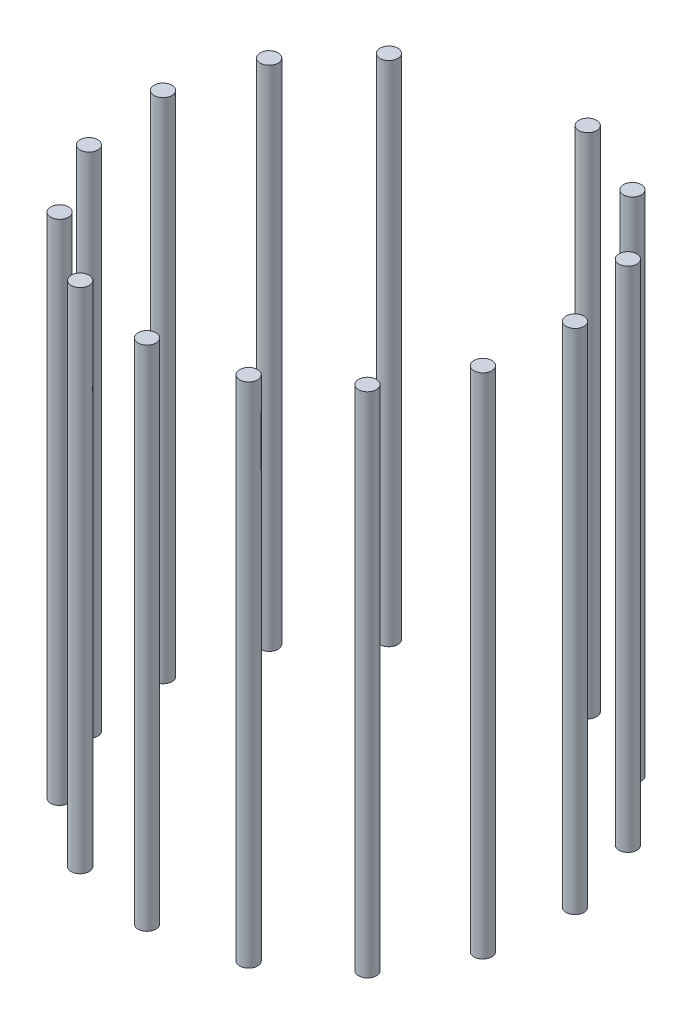
ISO-10303-21;
HEADER;
FILE_DESCRIPTION(('STEP AP214'),'2;1');
FILE_NAME('part.step','',(''),(''),'','','');
FILE_SCHEMA(('AUTOMOTIVE_DESIGN { 1 0 10303 214 1 1 1 1 }'));
ENDSEC;
DATA;
#1=APPLICATION_CONTEXT('core data for automotive mechanical design processes');
#2=APPLICATION_PROTOCOL_DEFINITION('international standard','automotive_design',2000,#1);
#3=PRODUCT_CONTEXT('',#1,'mechanical');
#4=PRODUCT('Part','Part','',(#3));
#5=PRODUCT_RELATED_PRODUCT_CATEGORY('part','',(#4));
#6=PRODUCT_DEFINITION_FORMATION('','',#4);
#7=PRODUCT_DEFINITION_CONTEXT('part definition',#1,'design');
#8=PRODUCT_DEFINITION('design','',#6,#7);
#9=PRODUCT_DEFINITION_SHAPE('','',#8);
#10=(LENGTH_UNIT() NAMED_UNIT(*) SI_UNIT(.MILLI.,.METRE.));
#11=(NAMED_UNIT(*) PLANE_ANGLE_UNIT() SI_UNIT($,.RADIAN.));
#12=(NAMED_UNIT(*) SI_UNIT($,.STERADIAN.) SOLID_ANGLE_UNIT());
#13=UNCERTAINTY_MEASURE_WITH_UNIT(LENGTH_MEASURE(1.E-05),#10,'distance_accuracy_value','');
#14=(GEOMETRIC_REPRESENTATION_CONTEXT(3) GLOBAL_UNCERTAINTY_ASSIGNED_CONTEXT((#13)) GLOBAL_UNIT_ASSIGNED_CONTEXT((#10,
#11,#12)) REPRESENTATION_CONTEXT('',''));
#15=CARTESIAN_POINT('',(0.,0.,0.));
#16=DIRECTION('',(0.,0.,1.));
#17=DIRECTION('',(1.,0.,0.));
#18=AXIS2_PLACEMENT_3D('',#15,#16,#17);
#19=CARTESIAN_POINT('',(9.40954454457373,19.9,-4.78134999789198));
#20=DIRECTION('',(0.,-1.,0.));
#21=DIRECTION('',(0.,0.,-1.));
#22=AXIS2_PLACEMENT_3D('',#19,#20,#21);
#23=CYLINDRICAL_SURFACE('',#22,0.350000000000002);
#24=CARTESIAN_POINT('',(9.40954454457373,19.9,-4.78134999789198));
#25=DIRECTION('',(0.,1.,0.));
#26=DIRECTION('',(0.,0.,1.));
#27=AXIS2_PLACEMENT_3D('',#24,#25,#26);
#28=CIRCLE('',#27,0.350000000000002);
#29=CARTESIAN_POINT('',(9.40954454457373,19.9,-4.43134999789198));
#30=VERTEX_POINT('',#29);
#31=EDGE_CURVE('E11',#30,#30,#28,.T.);
#32=ORIENTED_EDGE('',*,*,#31,.F.);
#33=EDGE_LOOP('',(#32));
#34=FACE_BOUND('',#33,.T.);
#35=CARTESIAN_POINT('',(9.40954454457373,0.,-4.78134999789198));
#36=DIRECTION('',(0.,1.,0.));
#37=DIRECTION('',(0.,0.,1.));
#38=AXIS2_PLACEMENT_3D('',#35,#36,#37);
#39=CIRCLE('',#38,0.350000000000002);
#40=CARTESIAN_POINT('',(9.40954454457373,0.,-4.43134999789198));
#41=VERTEX_POINT('',#40);
#42=EDGE_CURVE('E45',#41,#41,#39,.T.);
#43=ORIENTED_EDGE('',*,*,#42,.T.);
#44=EDGE_LOOP('',(#43));
#45=FACE_BOUND('',#44,.T.);
#46=ADVANCED_FACE('F42',(#34,#45),#23,.T.);
#47=CARTESIAN_POINT('',(9.40954454457373,19.9,-4.78134999789198));
#48=DIRECTION('',(0.,1.,0.));
#49=DIRECTION('',(0.,0.,1.));
#50=AXIS2_PLACEMENT_3D('',#47,#48,#49);
#51=PLANE('',#50);
#52=ORIENTED_EDGE('',*,*,#31,.T.);
#53=EDGE_LOOP('',(#52));
#54=FACE_BOUND('',#53,.T.);
#55=ADVANCED_FACE('F57',(#54),#51,.T.);
#56=CARTESIAN_POINT('',(9.40954454457373,0.,-4.78134999789198));
#57=DIRECTION('',(0.,1.,0.));
#58=DIRECTION('',(0.,0.,1.));
#59=AXIS2_PLACEMENT_3D('',#56,#57,#58);
#60=PLANE('',#59);
#61=ORIENTED_EDGE('',*,*,#42,.F.);
#62=EDGE_LOOP('',(#61));
#63=FACE_BOUND('',#62,.T.);
#64=ADVANCED_FACE('F55',(#63),#60,.F.);
#65=CLOSED_SHELL('',(#46,#55,#64));
#66=MANIFOLD_SOLID_BREP('B2',#65);
#67=CARTESIAN_POINT('',(7.22085409713997,19.9,-2.2761922090373));
#68=DIRECTION('',(0.,-1.,0.));
#69=DIRECTION('',(0.,0.,-1.));
#70=AXIS2_PLACEMENT_3D('',#67,#68,#69);
#71=CYLINDRICAL_SURFACE('',#70,0.35);
#72=CARTESIAN_POINT('',(7.22085409713997,19.9,-2.2761922090373));
#73=DIRECTION('',(0.,1.,0.));
#74=DIRECTION('',(0.,0.,1.));
#75=AXIS2_PLACEMENT_3D('',#72,#73,#74);
#76=CIRCLE('',#75,0.35);
#77=CARTESIAN_POINT('',(7.22085409713997,19.9,-1.9261922090373));
#78=VERTEX_POINT('',#77);
#79=EDGE_CURVE('E41',#78,#78,#76,.T.);
#80=ORIENTED_EDGE('',*,*,#79,.F.);
#81=EDGE_LOOP('',(#80));
#82=FACE_BOUND('',#81,.T.);
#83=CARTESIAN_POINT('',(7.22085409713997,0.,-2.2761922090373));
#84=DIRECTION('',(0.,1.,0.));
#85=DIRECTION('',(0.,0.,1.));
#86=AXIS2_PLACEMENT_3D('',#83,#84,#85);
#87=CIRCLE('',#86,0.35);
#88=CARTESIAN_POINT('',(7.22085409713997,0.,-1.9261922090373));
#89=VERTEX_POINT('',#88);
#90=EDGE_CURVE('E94',#89,#89,#87,.T.);
#91=ORIENTED_EDGE('',*,*,#90,.T.);
#92=EDGE_LOOP('',(#91));
#93=FACE_BOUND('',#92,.T.);
#94=ADVANCED_FACE('F91',(#82,#93),#71,.T.);
#95=CARTESIAN_POINT('',(7.22085409713997,19.9,-2.2761922090373));
#96=DIRECTION('',(0.,1.,0.));
#97=DIRECTION('',(0.,0.,1.));
#98=AXIS2_PLACEMENT_3D('',#95,#96,#97);
#99=PLANE('',#98);
#100=ORIENTED_EDGE('',*,*,#79,.T.);
#101=EDGE_LOOP('',(#100));
#102=FACE_BOUND('',#101,.T.);
#103=ADVANCED_FACE('F106',(#102),#99,.T.);
#104=CARTESIAN_POINT('',(7.22085409713997,0.,-2.2761922090373));
#105=DIRECTION('',(0.,1.,0.));
#106=DIRECTION('',(0.,0.,1.));
#107=AXIS2_PLACEMENT_3D('',#104,#105,#106);
#108=PLANE('',#107);
#109=ORIENTED_EDGE('',*,*,#90,.F.);
#110=EDGE_LOOP('',(#109));
#111=FACE_BOUND('',#110,.T.);
#112=ADVANCED_FACE('F104',(#111),#108,.F.);
#113=CLOSED_SHELL('',(#94,#103,#112));
#114=MANIFOLD_SOLID_BREP('B6',#113);
#115=CARTESIAN_POINT('',(6.24032535011504,19.9,0.902603914970171));
#116=DIRECTION('',(0.,-1.,0.));
#117=DIRECTION('',(0.,0.,-1.));
#118=AXIS2_PLACEMENT_3D('',#115,#116,#117);
#119=CYLINDRICAL_SURFACE('',#118,0.35);
#120=CARTESIAN_POINT('',(6.24032535011504,19.9,0.902603914970171));
#121=DIRECTION('',(0.,1.,0.));
#122=DIRECTION('',(0.,0.,1.));
#123=AXIS2_PLACEMENT_3D('',#120,#121,#122);
#124=CIRCLE('',#123,0.35);
#125=CARTESIAN_POINT('',(6.24032535011504,19.9,1.25260391497017));
#126=VERTEX_POINT('',#125);
#127=EDGE_CURVE('E90',#126,#126,#124,.T.);
#128=ORIENTED_EDGE('',*,*,#127,.F.);
#129=EDGE_LOOP('',(#128));
#130=FACE_BOUND('',#129,.T.);
#131=CARTESIAN_POINT('',(6.24032535011504,0.,0.902603914970171));
#132=DIRECTION('',(0.,1.,0.));
#133=DIRECTION('',(0.,0.,1.));
#134=AXIS2_PLACEMENT_3D('',#131,#132,#133);
#135=CIRCLE('',#134,0.35);
#136=CARTESIAN_POINT('',(6.24032535011504,0.,1.25260391497017));
#137=VERTEX_POINT('',#136);
#138=EDGE_CURVE('E143',#137,#137,#135,.T.);
#139=ORIENTED_EDGE('',*,*,#138,.T.);
#140=EDGE_LOOP('',(#139));
#141=FACE_BOUND('',#140,.T.);
#142=ADVANCED_FACE('F140',(#130,#141),#119,.T.);
#143=CARTESIAN_POINT('',(6.24032535011504,19.9,0.902603914970171));
#144=DIRECTION('',(0.,1.,0.));
#145=DIRECTION('',(0.,0.,1.));
#146=AXIS2_PLACEMENT_3D('',#143,#144,#145);
#147=PLANE('',#146);
#148=ORIENTED_EDGE('',*,*,#127,.T.);
#149=EDGE_LOOP('',(#148));
#150=FACE_BOUND('',#149,.T.);
#151=ADVANCED_FACE('F155',(#150),#147,.T.);
#152=CARTESIAN_POINT('',(6.24032535011504,0.,0.902603914970171));
#153=DIRECTION('',(0.,1.,0.));
#154=DIRECTION('',(0.,0.,1.));
#155=AXIS2_PLACEMENT_3D('',#152,#153,#154);
#156=PLANE('',#155);
#157=ORIENTED_EDGE('',*,*,#138,.F.);
#158=EDGE_LOOP('',(#157));
#159=FACE_BOUND('',#158,.T.);
#160=ADVANCED_FACE('F153',(#159),#156,.F.);
#161=CLOSED_SHELL('',(#142,#151,#160));
#162=MANIFOLD_SOLID_BREP('B36',#161);
#163=CARTESIAN_POINT('',(6.6375006316836,19.9,4.20539564583333));
#164=DIRECTION('',(0.,-1.,0.));
#165=DIRECTION('',(0.,0.,-1.));
#166=AXIS2_PLACEMENT_3D('',#163,#164,#165);
#167=CYLINDRICAL_SURFACE('',#166,0.35);
#168=CARTESIAN_POINT('',(6.6375006316836,19.9,4.20539564583333));
#169=DIRECTION('',(0.,1.,0.));
#170=DIRECTION('',(0.,0.,1.));
#171=AXIS2_PLACEMENT_3D('',#168,#169,#170);
#172=CIRCLE('',#171,0.35);
#173=CARTESIAN_POINT('',(6.6375006316836,19.9,4.55539564583333));
#174=VERTEX_POINT('',#173);
#175=EDGE_CURVE('E139',#174,#174,#172,.T.);
#176=ORIENTED_EDGE('',*,*,#175,.F.);
#177=EDGE_LOOP('',(#176));
#178=FACE_BOUND('',#177,.T.);
#179=CARTESIAN_POINT('',(6.6375006316836,0.,4.20539564583333));
#180=DIRECTION('',(0.,1.,0.));
#181=DIRECTION('',(0.,0.,1.));
#182=AXIS2_PLACEMENT_3D('',#179,#180,#181);
#183=CIRCLE('',#182,0.35);
#184=CARTESIAN_POINT('',(6.6375006316836,0.,4.55539564583333));
#185=VERTEX_POINT('',#184);
#186=EDGE_CURVE('E192',#185,#185,#183,.T.);
#187=ORIENTED_EDGE('',*,*,#186,.T.);
#188=EDGE_LOOP('',(#187));
#189=FACE_BOUND('',#188,.T.);
#190=ADVANCED_FACE('F189',(#178,#189),#167,.T.);
#191=CARTESIAN_POINT('',(6.6375006316836,19.9,4.20539564583333));
#192=DIRECTION('',(0.,1.,0.));
#193=DIRECTION('',(0.,0.,1.));
#194=AXIS2_PLACEMENT_3D('',#191,#192,#193);
#195=PLANE('',#194);
#196=ORIENTED_EDGE('',*,*,#175,.T.);
#197=EDGE_LOOP('',(#196));
#198=FACE_BOUND('',#197,.T.);
#199=ADVANCED_FACE('F204',(#198),#195,.T.);
#200=CARTESIAN_POINT('',(6.6375006316836,0.,4.20539564583333));
#201=DIRECTION('',(0.,1.,0.));
#202=DIRECTION('',(0.,0.,1.));
#203=AXIS2_PLACEMENT_3D('',#200,#201,#202);
#204=PLANE('',#203);
#205=ORIENTED_EDGE('',*,*,#186,.F.);
#206=EDGE_LOOP('',(#205));
#207=FACE_BOUND('',#206,.T.);
#208=ADVANCED_FACE('F202',(#207),#204,.F.);
#209=CLOSED_SHELL('',(#190,#199,#208));
#210=MANIFOLD_SOLID_BREP('B85',#209);
#211=CARTESIAN_POINT('',(8.34370472743826,19.9,7.06110028836503));
#212=DIRECTION('',(0.,-1.,0.));
#213=DIRECTION('',(0.,0.,-1.));
#214=AXIS2_PLACEMENT_3D('',#211,#212,#213);
#215=CYLINDRICAL_SURFACE('',#214,0.35);
#216=CARTESIAN_POINT('',(8.34370472743826,19.9,7.06110028836503));
#217=DIRECTION('',(0.,1.,0.));
#218=DIRECTION('',(0.,0.,1.));
#219=AXIS2_PLACEMENT_3D('',#216,#217,#218);
#220=CIRCLE('',#219,0.35);
#221=CARTESIAN_POINT('',(8.34370472743826,19.9,7.41110028836503));
#222=VERTEX_POINT('',#221);
#223=EDGE_CURVE('E188',#222,#222,#220,.T.);
#224=ORIENTED_EDGE('',*,*,#223,.F.);
#225=EDGE_LOOP('',(#224));
#226=FACE_BOUND('',#225,.T.);
#227=CARTESIAN_POINT('',(8.34370472743826,0.,7.06110028836503));
#228=DIRECTION('',(0.,1.,0.));
#229=DIRECTION('',(0.,0.,1.));
#230=AXIS2_PLACEMENT_3D('',#227,#228,#229);
#231=CIRCLE('',#230,0.35);
#232=CARTESIAN_POINT('',(8.34370472743826,0.,7.41110028836503));
#233=VERTEX_POINT('',#232);
#234=EDGE_CURVE('E241',#233,#233,#231,.T.);
#235=ORIENTED_EDGE('',*,*,#234,.T.);
#236=EDGE_LOOP('',(#235));
#237=FACE_BOUND('',#236,.T.);
#238=ADVANCED_FACE('F238',(#226,#237),#215,.T.);
#239=CARTESIAN_POINT('',(8.34370472743826,19.9,7.06110028836503));
#240=DIRECTION('',(0.,1.,0.));
#241=DIRECTION('',(0.,0.,1.));
#242=AXIS2_PLACEMENT_3D('',#239,#240,#241);
#243=PLANE('',#242);
#244=ORIENTED_EDGE('',*,*,#223,.T.);
#245=EDGE_LOOP('',(#244));
#246=FACE_BOUND('',#245,.T.);
#247=ADVANCED_FACE('F253',(#246),#243,.T.);
#248=CARTESIAN_POINT('',(8.34370472743826,0.,7.06110028836503));
#249=DIRECTION('',(0.,1.,0.));
#250=DIRECTION('',(0.,0.,1.));
#251=AXIS2_PLACEMENT_3D('',#248,#249,#250);
#252=PLANE('',#251);
#253=ORIENTED_EDGE('',*,*,#234,.F.);
#254=EDGE_LOOP('',(#253));
#255=FACE_BOUND('',#254,.T.);
#256=ADVANCED_FACE('F251',(#255),#252,.F.);
#257=CLOSED_SHELL('',(#238,#247,#256));
#258=MANIFOLD_SOLID_BREP('B134',#257);
#259=CARTESIAN_POINT('',(11.0639194488455,19.9,8.97594056660932));
#260=DIRECTION('',(0.,-1.,0.));
#261=DIRECTION('',(0.,0.,-1.));
#262=AXIS2_PLACEMENT_3D('',#259,#260,#261);
#263=CYLINDRICAL_SURFACE('',#262,0.35);
#264=CARTESIAN_POINT('',(11.0639194488455,19.9,8.97594056660932));
#265=DIRECTION('',(0.,1.,0.));
#266=DIRECTION('',(0.,0.,1.));
#267=AXIS2_PLACEMENT_3D('',#264,#265,#266);
#268=CIRCLE('',#267,0.35);
#269=CARTESIAN_POINT('',(11.0639194488455,19.9,9.32594056660932));
#270=VERTEX_POINT('',#269);
#271=EDGE_CURVE('E237',#270,#270,#268,.T.);
#272=ORIENTED_EDGE('',*,*,#271,.F.);
#273=EDGE_LOOP('',(#272));
#274=FACE_BOUND('',#273,.T.);
#275=CARTESIAN_POINT('',(11.0639194488455,0.,8.97594056660932));
#276=DIRECTION('',(0.,1.,0.));
#277=DIRECTION('',(0.,0.,1.));
#278=AXIS2_PLACEMENT_3D('',#275,#276,#277);
#279=CIRCLE('',#278,0.35);
#280=CARTESIAN_POINT('',(11.0639194488455,0.,9.32594056660932));
#281=VERTEX_POINT('',#280);
#282=EDGE_CURVE('E290',#281,#281,#279,.T.);
#283=ORIENTED_EDGE('',*,*,#282,.T.);
#284=EDGE_LOOP('',(#283));
#285=FACE_BOUND('',#284,.T.);
#286=ADVANCED_FACE('F287',(#274,#285),#263,.T.);
#287=CARTESIAN_POINT('',(11.0639194488455,19.9,8.97594056660932));
#288=DIRECTION('',(0.,1.,0.));
#289=DIRECTION('',(0.,0.,1.));
#290=AXIS2_PLACEMENT_3D('',#287,#288,#289);
#291=PLANE('',#290);
#292=ORIENTED_EDGE('',*,*,#271,.T.);
#293=EDGE_LOOP('',(#292));
#294=FACE_BOUND('',#293,.T.);
#295=ADVANCED_FACE('F302',(#294),#291,.T.);
#296=CARTESIAN_POINT('',(11.0639194488455,0.,8.97594056660932));
#297=DIRECTION('',(0.,1.,0.));
#298=DIRECTION('',(0.,0.,1.));
#299=AXIS2_PLACEMENT_3D('',#296,#297,#298);
#300=PLANE('',#299);
#301=ORIENTED_EDGE('',*,*,#282,.F.);
#302=EDGE_LOOP('',(#301));
#303=FACE_BOUND('',#302,.T.);
#304=ADVANCED_FACE('F300',(#303),#300,.F.);
#305=CLOSED_SHELL('',(#286,#295,#304));
#306=MANIFOLD_SOLID_BREP('B183',#305);
#307=CARTESIAN_POINT('',(14.327794958199,19.9,9.61882320067994));
#308=DIRECTION('',(0.,-1.,0.));
#309=DIRECTION('',(0.,0.,-1.));
#310=AXIS2_PLACEMENT_3D('',#307,#308,#309);
#311=CYLINDRICAL_SURFACE('',#310,0.349999999999999);
#312=CARTESIAN_POINT('',(14.327794958199,19.9,9.61882320067994));
#313=DIRECTION('',(0.,1.,0.));
#314=DIRECTION('',(0.,0.,1.));
#315=AXIS2_PLACEMENT_3D('',#312,#313,#314);
#316=CIRCLE('',#315,0.349999999999999);
#317=CARTESIAN_POINT('',(14.327794958199,19.9,9.96882320067994));
#318=VERTEX_POINT('',#317);
#319=EDGE_CURVE('E286',#318,#318,#316,.T.);
#320=ORIENTED_EDGE('',*,*,#319,.F.);
#321=EDGE_LOOP('',(#320));
#322=FACE_BOUND('',#321,.T.);
#323=CARTESIAN_POINT('',(14.327794958199,0.,9.61882320067994));
#324=DIRECTION('',(0.,1.,0.));
#325=DIRECTION('',(0.,0.,1.));
#326=AXIS2_PLACEMENT_3D('',#323,#324,#325);
#327=CIRCLE('',#326,0.349999999999999);
#328=CARTESIAN_POINT('',(14.327794958199,0.,9.96882320067994));
#329=VERTEX_POINT('',#328);
#330=EDGE_CURVE('E339',#329,#329,#327,.T.);
#331=ORIENTED_EDGE('',*,*,#330,.T.);
#332=EDGE_LOOP('',(#331));
#333=FACE_BOUND('',#332,.T.);
#334=ADVANCED_FACE('F336',(#322,#333),#311,.T.);
#335=CARTESIAN_POINT('',(14.327794958199,19.9,9.61882320067994));
#336=DIRECTION('',(0.,1.,0.));
#337=DIRECTION('',(0.,0.,1.));
#338=AXIS2_PLACEMENT_3D('',#335,#336,#337);
#339=PLANE('',#338);
#340=ORIENTED_EDGE('',*,*,#319,.T.);
#341=EDGE_LOOP('',(#340));
#342=FACE_BOUND('',#341,.T.);
#343=ADVANCED_FACE('F351',(#342),#339,.T.);
#344=CARTESIAN_POINT('',(14.327794958199,0.,9.61882320067994));
#345=DIRECTION('',(0.,1.,0.));
#346=DIRECTION('',(0.,0.,1.));
#347=AXIS2_PLACEMENT_3D('',#344,#345,#346);
#348=PLANE('',#347);
#349=ORIENTED_EDGE('',*,*,#330,.F.);
#350=EDGE_LOOP('',(#349));
#351=FACE_BOUND('',#350,.T.);
#352=ADVANCED_FACE('F349',(#351),#348,.F.);
#353=CLOSED_SHELL('',(#334,#343,#352));
#354=MANIFOLD_SOLID_BREP('B232',#353);
#355=CARTESIAN_POINT('',(17.5709775285534,19.9,8.87858794274069));
#356=DIRECTION('',(0.,-1.,0.));
#357=DIRECTION('',(0.,0.,-1.));
#358=AXIS2_PLACEMENT_3D('',#355,#356,#357);
#359=CYLINDRICAL_SURFACE('',#358,0.350000000000003);
#360=CARTESIAN_POINT('',(17.5709775285534,19.9,8.87858794274069));
#361=DIRECTION('',(0.,1.,0.));
#362=DIRECTION('',(0.,0.,1.));
#363=AXIS2_PLACEMENT_3D('',#360,#361,#362);
#364=CIRCLE('',#363,0.350000000000003);
#365=CARTESIAN_POINT('',(17.5709775285534,19.9,9.2285879427407));
#366=VERTEX_POINT('',#365);
#367=EDGE_CURVE('E335',#366,#366,#364,.T.);
#368=ORIENTED_EDGE('',*,*,#367,.F.);
#369=EDGE_LOOP('',(#368));
#370=FACE_BOUND('',#369,.T.);
#371=CARTESIAN_POINT('',(17.5709775285534,0.,8.87858794274069));
#372=DIRECTION('',(0.,1.,0.));
#373=DIRECTION('',(0.,0.,1.));
#374=AXIS2_PLACEMENT_3D('',#371,#372,#373);
#375=CIRCLE('',#374,0.350000000000003);
#376=CARTESIAN_POINT('',(17.5709775285534,0.,9.2285879427407));
#377=VERTEX_POINT('',#376);
#378=EDGE_CURVE('E388',#377,#377,#375,.T.);
#379=ORIENTED_EDGE('',*,*,#378,.T.);
#380=EDGE_LOOP('',(#379));
#381=FACE_BOUND('',#380,.T.);
#382=ADVANCED_FACE('F385',(#370,#381),#359,.T.);
#383=CARTESIAN_POINT('',(17.5709775285534,19.9,8.87858794274069));
#384=DIRECTION('',(0.,1.,0.));
#385=DIRECTION('',(0.,0.,1.));
#386=AXIS2_PLACEMENT_3D('',#383,#384,#385);
#387=PLANE('',#386);
#388=ORIENTED_EDGE('',*,*,#367,.T.);
#389=EDGE_LOOP('',(#388));
#390=FACE_BOUND('',#389,.T.);
#391=ADVANCED_FACE('F400',(#390),#387,.T.);
#392=CARTESIAN_POINT('',(17.5709775285534,0.,8.87858794274069));
#393=DIRECTION('',(0.,1.,0.));
#394=DIRECTION('',(0.,0.,1.));
#395=AXIS2_PLACEMENT_3D('',#392,#393,#394);
#396=PLANE('',#395);
#397=ORIENTED_EDGE('',*,*,#378,.F.);
#398=EDGE_LOOP('',(#397));
#399=FACE_BOUND('',#398,.T.);
#400=ADVANCED_FACE('F398',(#399),#396,.F.);
#401=CLOSED_SHELL('',(#382,#391,#400));
#402=MANIFOLD_SOLID_BREP('B281',#401);
#403=CARTESIAN_POINT('',(20.2326914301058,19.9,6.8832281937155));
#404=DIRECTION('',(0.,-1.,0.));
#405=DIRECTION('',(0.,0.,-1.));
#406=AXIS2_PLACEMENT_3D('',#403,#404,#405);
#407=CYLINDRICAL_SURFACE('',#406,0.349999999999999);
#408=CARTESIAN_POINT('',(20.2326914301058,19.9,6.8832281937155));
#409=DIRECTION('',(0.,1.,0.));
#410=DIRECTION('',(0.,0.,1.));
#411=AXIS2_PLACEMENT_3D('',#408,#409,#410);
#412=CIRCLE('',#411,0.349999999999999);
#413=CARTESIAN_POINT('',(20.2326914301058,19.9,7.2332281937155));
#414=VERTEX_POINT('',#413);
#415=EDGE_CURVE('E384',#414,#414,#412,.T.);
#416=ORIENTED_EDGE('',*,*,#415,.F.);
#417=EDGE_LOOP('',(#416));
#418=FACE_BOUND('',#417,.T.);
#419=CARTESIAN_POINT('',(20.2326914301058,0.,6.8832281937155));
#420=DIRECTION('',(0.,1.,0.));
#421=DIRECTION('',(0.,0.,1.));
#422=AXIS2_PLACEMENT_3D('',#419,#420,#421);
#423=CIRCLE('',#422,0.349999999999999);
#424=CARTESIAN_POINT('',(20.2326914301058,0.,7.2332281937155));
#425=VERTEX_POINT('',#424);
#426=EDGE_CURVE('E437',#425,#425,#423,.T.);
#427=ORIENTED_EDGE('',*,*,#426,.T.);
#428=EDGE_LOOP('',(#427));
#429=FACE_BOUND('',#428,.T.);
#430=ADVANCED_FACE('F434',(#418,#429),#407,.T.);
#431=CARTESIAN_POINT('',(20.2326914301058,19.9,6.8832281937155));
#432=DIRECTION('',(0.,1.,0.));
#433=DIRECTION('',(0.,0.,1.));
#434=AXIS2_PLACEMENT_3D('',#431,#432,#433);
#435=PLANE('',#434);
#436=ORIENTED_EDGE('',*,*,#415,.T.);
#437=EDGE_LOOP('',(#436));
#438=FACE_BOUND('',#437,.T.);
#439=ADVANCED_FACE('F449',(#438),#435,.T.);
#440=CARTESIAN_POINT('',(20.2326914301058,0.,6.8832281937155));
#441=DIRECTION('',(0.,1.,0.));
#442=DIRECTION('',(0.,0.,1.));
#443=AXIS2_PLACEMENT_3D('',#440,#441,#442);
#444=PLANE('',#443);
#445=ORIENTED_EDGE('',*,*,#426,.F.);
#446=EDGE_LOOP('',(#445));
#447=FACE_BOUND('',#446,.T.);
#448=ADVANCED_FACE('F447',(#447),#444,.F.);
#449=CLOSED_SHELL('',(#430,#439,#448));
#450=MANIFOLD_SOLID_BREP('B330',#449);
#451=CARTESIAN_POINT('',(21.8527021483661,19.9,3.97775978148504));
#452=DIRECTION('',(0.,-1.,0.));
#453=DIRECTION('',(0.,0.,-1.));
#454=AXIS2_PLACEMENT_3D('',#451,#452,#453);
#455=CYLINDRICAL_SURFACE('',#454,0.350000000000001);
#456=CARTESIAN_POINT('',(21.8527021483661,19.9,3.97775978148504));
#457=DIRECTION('',(0.,1.,0.));
#458=DIRECTION('',(0.,0.,1.));
#459=AXIS2_PLACEMENT_3D('',#456,#457,#458);
#460=CIRCLE('',#459,0.350000000000001);
#461=CARTESIAN_POINT('',(21.8527021483661,19.9,4.32775978148504));
#462=VERTEX_POINT('',#461);
#463=EDGE_CURVE('E433',#462,#462,#460,.T.);
#464=ORIENTED_EDGE('',*,*,#463,.F.);
#465=EDGE_LOOP('',(#464));
#466=FACE_BOUND('',#465,.T.);
#467=CARTESIAN_POINT('',(21.8527021483661,0.,3.97775978148504));
#468=DIRECTION('',(0.,1.,0.));
#469=DIRECTION('',(0.,0.,1.));
#470=AXIS2_PLACEMENT_3D('',#467,#468,#469);
#471=CIRCLE('',#470,0.350000000000001);
#472=CARTESIAN_POINT('',(21.8527021483661,0.,4.32775978148504));
#473=VERTEX_POINT('',#472);
#474=EDGE_CURVE('E486',#473,#473,#471,.T.);
#475=ORIENTED_EDGE('',*,*,#474,.T.);
#476=EDGE_LOOP('',(#475));
#477=FACE_BOUND('',#476,.T.);
#478=ADVANCED_FACE('F483',(#466,#477),#455,.T.);
#479=CARTESIAN_POINT('',(21.8527021483661,19.9,3.97775978148504));
#480=DIRECTION('',(0.,1.,0.));
#481=DIRECTION('',(0.,0.,1.));
#482=AXIS2_PLACEMENT_3D('',#479,#480,#481);
#483=PLANE('',#482);
#484=ORIENTED_EDGE('',*,*,#463,.T.);
#485=EDGE_LOOP('',(#484));
#486=FACE_BOUND('',#485,.T.);
#487=ADVANCED_FACE('F498',(#486),#483,.T.);
#488=CARTESIAN_POINT('',(21.8527021483661,0.,3.97775978148504));
#489=DIRECTION('',(0.,1.,0.));
#490=DIRECTION('',(0.,0.,1.));
#491=AXIS2_PLACEMENT_3D('',#488,#489,#490);
#492=PLANE('',#491);
#493=ORIENTED_EDGE('',*,*,#474,.F.);
#494=EDGE_LOOP('',(#493));
#495=FACE_BOUND('',#494,.T.);
#496=ADVANCED_FACE('F496',(#495),#492,.F.);
#497=CLOSED_SHELL('',(#478,#487,#496));
#498=MANIFOLD_SOLID_BREP('B379',#497);
#499=CARTESIAN_POINT('',(22.1508951128117,19.9,0.664564589875845));
#500=DIRECTION('',(0.,-1.,0.));
#501=DIRECTION('',(0.,0.,-1.));
#502=AXIS2_PLACEMENT_3D('',#499,#500,#501);
#503=CYLINDRICAL_SURFACE('',#502,0.35);
#504=CARTESIAN_POINT('',(22.1508951128117,19.9,0.664564589875845));
#505=DIRECTION('',(0.,1.,0.));
#506=DIRECTION('',(0.,0.,1.));
#507=AXIS2_PLACEMENT_3D('',#504,#505,#506);
#508=CIRCLE('',#507,0.35);
#509=CARTESIAN_POINT('',(22.1508951128117,19.9,1.01456458987584));
#510=VERTEX_POINT('',#509);
#511=EDGE_CURVE('E482',#510,#510,#508,.T.);
#512=ORIENTED_EDGE('',*,*,#511,.F.);
#513=EDGE_LOOP('',(#512));
#514=FACE_BOUND('',#513,.T.);
#515=CARTESIAN_POINT('',(22.1508951128117,0.,0.664564589875845));
#516=DIRECTION('',(0.,1.,0.));
#517=DIRECTION('',(0.,0.,1.));
#518=AXIS2_PLACEMENT_3D('',#515,#516,#517);
#519=CIRCLE('',#518,0.35);
#520=CARTESIAN_POINT('',(22.1508951128117,0.,1.01456458987584));
#521=VERTEX_POINT('',#520);
#522=EDGE_CURVE('E535',#521,#521,#519,.T.);
#523=ORIENTED_EDGE('',*,*,#522,.T.);
#524=EDGE_LOOP('',(#523));
#525=FACE_BOUND('',#524,.T.);
#526=ADVANCED_FACE('F532',(#514,#525),#503,.T.);
#527=CARTESIAN_POINT('',(22.1508951128117,19.9,0.664564589875845));
#528=DIRECTION('',(0.,1.,0.));
#529=DIRECTION('',(0.,0.,1.));
#530=AXIS2_PLACEMENT_3D('',#527,#528,#529);
#531=PLANE('',#530);
#532=ORIENTED_EDGE('',*,*,#511,.T.);
#533=EDGE_LOOP('',(#532));
#534=FACE_BOUND('',#533,.T.);
#535=ADVANCED_FACE('F547',(#534),#531,.T.);
#536=CARTESIAN_POINT('',(22.1508951128117,0.,0.664564589875845));
#537=DIRECTION('',(0.,1.,0.));
#538=DIRECTION('',(0.,0.,1.));
#539=AXIS2_PLACEMENT_3D('',#536,#537,#538);
#540=PLANE('',#539);
#541=ORIENTED_EDGE('',*,*,#522,.F.);
#542=EDGE_LOOP('',(#541));
#543=FACE_BOUND('',#542,.T.);
#544=ADVANCED_FACE('F545',(#543),#540,.F.);
#545=CLOSED_SHELL('',(#526,#535,#544));
#546=MANIFOLD_SOLID_BREP('B428',#545);
#547=CARTESIAN_POINT('',(21.0757100508919,19.9,-2.48347583304946));
#548=DIRECTION('',(0.,-1.,0.));
#549=DIRECTION('',(0.,0.,-1.));
#550=AXIS2_PLACEMENT_3D('',#547,#548,#549);
#551=CYLINDRICAL_SURFACE('',#550,0.349999999999998);
#552=CARTESIAN_POINT('',(21.0757100508919,19.9,-2.48347583304946));
#553=DIRECTION('',(0.,1.,0.));
#554=DIRECTION('',(0.,0.,1.));
#555=AXIS2_PLACEMENT_3D('',#552,#553,#554);
#556=CIRCLE('',#555,0.349999999999998);
#557=CARTESIAN_POINT('',(21.0757100508919,19.9,-2.13347583304947));
#558=VERTEX_POINT('',#557);
#559=EDGE_CURVE('E531',#558,#558,#556,.T.);
#560=ORIENTED_EDGE('',*,*,#559,.F.);
#561=EDGE_LOOP('',(#560));
#562=FACE_BOUND('',#561,.T.);
#563=CARTESIAN_POINT('',(21.0757100508919,0.,-2.48347583304946));
#564=DIRECTION('',(0.,1.,0.));
#565=DIRECTION('',(0.,0.,1.));
#566=AXIS2_PLACEMENT_3D('',#563,#564,#565);
#567=CIRCLE('',#566,0.349999999999998);
#568=CARTESIAN_POINT('',(21.0757100508919,0.,-2.13347583304947));
#569=VERTEX_POINT('',#568);
#570=EDGE_CURVE('E584',#569,#569,#567,.T.);
#571=ORIENTED_EDGE('',*,*,#570,.T.);
#572=EDGE_LOOP('',(#571));
#573=FACE_BOUND('',#572,.T.);
#574=ADVANCED_FACE('F581',(#562,#573),#551,.T.);
#575=CARTESIAN_POINT('',(21.0757100508919,19.9,-2.48347583304946));
#576=DIRECTION('',(0.,1.,0.));
#577=DIRECTION('',(0.,0.,1.));
#578=AXIS2_PLACEMENT_3D('',#575,#576,#577);
#579=PLANE('',#578);
#580=ORIENTED_EDGE('',*,*,#559,.T.);
#581=EDGE_LOOP('',(#580));
#582=FACE_BOUND('',#581,.T.);
#583=ADVANCED_FACE('F596',(#582),#579,.T.);
#584=CARTESIAN_POINT('',(21.0757100508919,0.,-2.48347583304946));
#585=DIRECTION('',(0.,1.,0.));
#586=DIRECTION('',(0.,0.,1.));
#587=AXIS2_PLACEMENT_3D('',#584,#585,#586);
#588=PLANE('',#587);
#589=ORIENTED_EDGE('',*,*,#570,.F.);
#590=EDGE_LOOP('',(#589));
#591=FACE_BOUND('',#590,.T.);
#592=ADVANCED_FACE('F594',(#591),#588,.F.);
#593=CLOSED_SHELL('',(#574,#583,#592));
#594=MANIFOLD_SOLID_BREP('B477',#593);
#595=CARTESIAN_POINT('',(18.8130562275624,19.9,-4.92203669911768));
#596=DIRECTION('',(0.,-1.,0.));
#597=DIRECTION('',(0.,0.,-1.));
#598=AXIS2_PLACEMENT_3D('',#595,#596,#597);
#599=CYLINDRICAL_SURFACE('',#598,0.35);
#600=CARTESIAN_POINT('',(18.8130562275624,19.9,-4.92203669911768));
#601=DIRECTION('',(0.,1.,0.));
#602=DIRECTION('',(0.,0.,1.));
#603=AXIS2_PLACEMENT_3D('',#600,#601,#602);
#604=CIRCLE('',#603,0.35);
#605=CARTESIAN_POINT('',(18.8130562275624,19.9,-4.57203669911768));
#606=VERTEX_POINT('',#605);
#607=EDGE_CURVE('E580',#606,#606,#604,.T.);
#608=ORIENTED_EDGE('',*,*,#607,.F.);
#609=EDGE_LOOP('',(#608));
#610=FACE_BOUND('',#609,.T.);
#611=CARTESIAN_POINT('',(18.8130562275624,0.,-4.92203669911768));
#612=DIRECTION('',(0.,1.,0.));
#613=DIRECTION('',(0.,0.,1.));
#614=AXIS2_PLACEMENT_3D('',#611,#612,#613);
#615=CIRCLE('',#614,0.35);
#616=CARTESIAN_POINT('',(18.8130562275624,0.,-4.57203669911768));
#617=VERTEX_POINT('',#616);
#618=EDGE_CURVE('E632',#617,#617,#615,.T.);
#619=ORIENTED_EDGE('',*,*,#618,.T.);
#620=EDGE_LOOP('',(#619));
#621=FACE_BOUND('',#620,.T.);
#622=ADVANCED_FACE('F629',(#610,#621),#599,.T.);
#623=CARTESIAN_POINT('',(18.8130562275624,19.9,-4.92203669911768));
#624=DIRECTION('',(0.,1.,0.));
#625=DIRECTION('',(0.,0.,1.));
#626=AXIS2_PLACEMENT_3D('',#623,#624,#625);
#627=PLANE('',#626);
#628=ORIENTED_EDGE('',*,*,#607,.T.);
#629=EDGE_LOOP('',(#628));
#630=FACE_BOUND('',#629,.T.);
#631=ADVANCED_FACE('F644',(#630),#627,.T.);
#632=CARTESIAN_POINT('',(18.8130562275624,0.,-4.92203669911768));
#633=DIRECTION('',(0.,1.,0.));
#634=DIRECTION('',(0.,0.,1.));
#635=AXIS2_PLACEMENT_3D('',#632,#633,#634);
#636=PLANE('',#635);
#637=ORIENTED_EDGE('',*,*,#618,.F.);
#638=EDGE_LOOP('',(#637));
#639=FACE_BOUND('',#638,.T.);
#640=ADVANCED_FACE('F642',(#639),#636,.F.);
#641=CLOSED_SHELL('',(#622,#631,#640));
#642=MANIFOLD_SOLID_BREP('B526',#641);
#643=CARTESIAN_POINT('',(15.7541670444414,19.9,-6.22946868095563));
#644=DIRECTION('',(0.,-1.,0.));
#645=DIRECTION('',(0.,0.,-1.));
#646=AXIS2_PLACEMENT_3D('',#643,#644,#645);
#647=CYLINDRICAL_SURFACE('',#646,0.350000000000002);
#648=CARTESIAN_POINT('',(15.7541670444414,19.9,-6.22946868095563));
#649=DIRECTION('',(0.,1.,0.));
#650=DIRECTION('',(0.,0.,1.));
#651=AXIS2_PLACEMENT_3D('',#648,#649,#650);
#652=CIRCLE('',#651,0.350000000000002);
#653=CARTESIAN_POINT('',(15.7541670444414,19.9,-5.87946868095562));
#654=VERTEX_POINT('',#653);
#655=EDGE_CURVE('E628',#654,#654,#652,.T.);
#656=ORIENTED_EDGE('',*,*,#655,.F.);
#657=EDGE_LOOP('',(#656));
#658=FACE_BOUND('',#657,.T.);
#659=CARTESIAN_POINT('',(15.7541670444414,0.,-6.22946868095563));
#660=DIRECTION('',(0.,1.,0.));
#661=DIRECTION('',(0.,0.,1.));
#662=AXIS2_PLACEMENT_3D('',#659,#660,#661);
#663=CIRCLE('',#662,0.350000000000002);
#664=CARTESIAN_POINT('',(15.7541670444414,0.,-5.87946868095562));
#665=VERTEX_POINT('',#664);
#666=EDGE_CURVE('E673',#665,#665,#663,.T.);
#667=ORIENTED_EDGE('',*,*,#666,.T.);
#668=EDGE_LOOP('',(#667));
#669=FACE_BOUND('',#668,.T.);
#670=ADVANCED_FACE('F670',(#658,#669),#647,.T.);
#671=CARTESIAN_POINT('',(15.7541670444414,19.9,-6.22946868095563));
#672=DIRECTION('',(0.,1.,0.));
#673=DIRECTION('',(0.,0.,1.));
#674=AXIS2_PLACEMENT_3D('',#671,#672,#673);
#675=PLANE('',#674);
#676=ORIENTED_EDGE('',*,*,#655,.T.);
#677=EDGE_LOOP('',(#676));
#678=FACE_BOUND('',#677,.T.);
#679=ADVANCED_FACE('F685',(#678),#675,.T.);
#680=CARTESIAN_POINT('',(15.7541670444414,0.,-6.22946868095563));
#681=DIRECTION('',(0.,1.,0.));
#682=DIRECTION('',(0.,0.,1.));
#683=AXIS2_PLACEMENT_3D('',#680,#681,#682);
#684=PLANE('',#683);
#685=ORIENTED_EDGE('',*,*,#666,.F.);
#686=EDGE_LOOP('',(#685));
#687=FACE_BOUND('',#686,.T.);
#688=ADVANCED_FACE('F683',(#687),#684,.F.);
#689=CLOSED_SHELL('',(#670,#679,#688));
#690=MANIFOLD_SOLID_BREP('B575',#689);
#691=ADVANCED_BREP_SHAPE_REPRESENTATION('',(#18,#66,#114,#162,#210,#258,#306,#354,#402,#450,
#498,#546,#594,#642,#690),#14);
#692=SHAPE_DEFINITION_REPRESENTATION(#9,#691);
ENDSEC;
END-ISO-10303-21;
